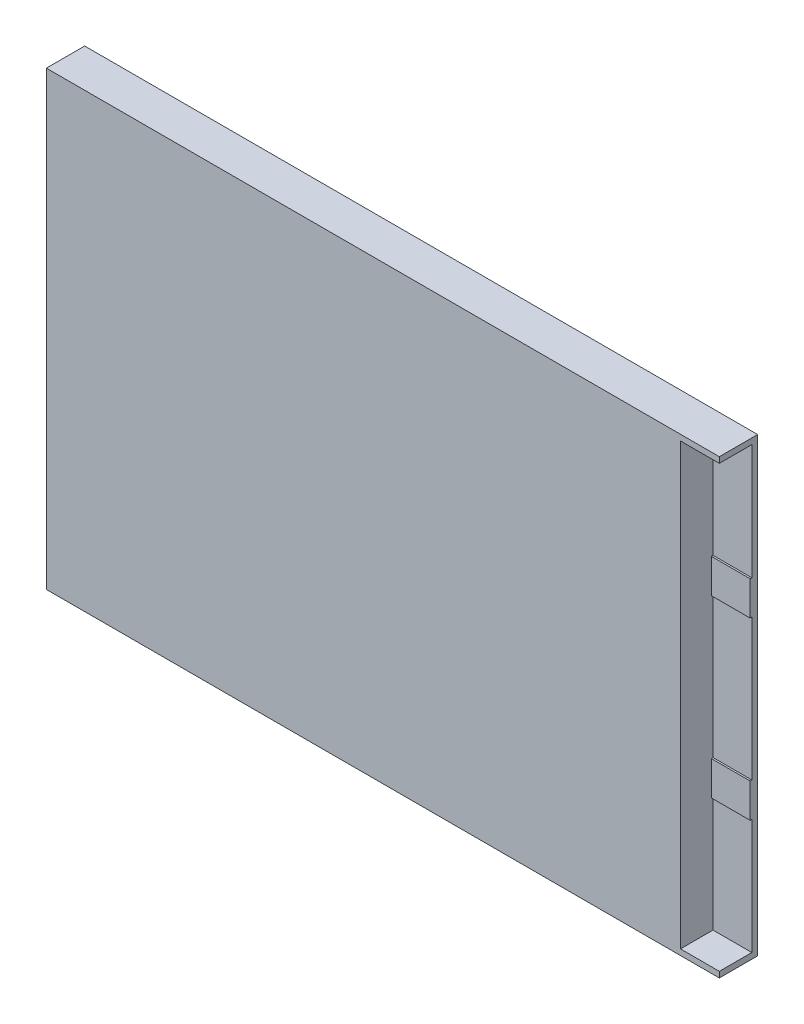
ISO-10303-21;
HEADER;
FILE_DESCRIPTION(('STEP AP214'),'2;1');
FILE_NAME('part.step','',(''),(''),'','','');
FILE_SCHEMA(('AUTOMOTIVE_DESIGN { 1 0 10303 214 1 1 1 1 }'));
ENDSEC;
DATA;
#1=APPLICATION_CONTEXT('core data for automotive mechanical design processes');
#2=APPLICATION_PROTOCOL_DEFINITION('international standard','automotive_design',2000,#1);
#3=PRODUCT_CONTEXT('',#1,'mechanical');
#4=PRODUCT('Part','Part','',(#3));
#5=PRODUCT_RELATED_PRODUCT_CATEGORY('part','',(#4));
#6=PRODUCT_DEFINITION_FORMATION('','',#4);
#7=PRODUCT_DEFINITION_CONTEXT('part definition',#1,'design');
#8=PRODUCT_DEFINITION('design','',#6,#7);
#9=PRODUCT_DEFINITION_SHAPE('','',#8);
#10=(LENGTH_UNIT() NAMED_UNIT(*) SI_UNIT(.MILLI.,.METRE.));
#11=(NAMED_UNIT(*) PLANE_ANGLE_UNIT() SI_UNIT($,.RADIAN.));
#12=(NAMED_UNIT(*) SI_UNIT($,.STERADIAN.) SOLID_ANGLE_UNIT());
#13=UNCERTAINTY_MEASURE_WITH_UNIT(LENGTH_MEASURE(1.E-05),#10,'distance_accuracy_value','');
#14=(GEOMETRIC_REPRESENTATION_CONTEXT(3) GLOBAL_UNCERTAINTY_ASSIGNED_CONTEXT((#13)) GLOBAL_UNIT_ASSIGNED_CONTEXT((#10,
#11,#12)) REPRESENTATION_CONTEXT('',''));
#15=CARTESIAN_POINT('',(0.,0.,0.));
#16=DIRECTION('',(0.,0.,1.));
#17=DIRECTION('',(1.,0.,0.));
#18=AXIS2_PLACEMENT_3D('',#15,#16,#17);
#19=CARTESIAN_POINT('',(50.165,33.655,-1.9939));
#20=DIRECTION('',(0.,0.,-1.));
#21=DIRECTION('',(-1.,0.,0.));
#22=AXIS2_PLACEMENT_3D('',#19,#20,#21);
#23=PLANE('',#22);
#24=DIRECTION('',(-1.,0.,0.));
#25=VECTOR('',#24,1.);
#26=CARTESIAN_POINT('',(50.165,15.5956,-1.9939));
#27=LINE('',#26,#25);
#28=CARTESIAN_POINT('',(50.165,15.5956,-1.9939));
#29=VERTEX_POINT('',#28);
#30=CARTESIAN_POINT('',(44.3738,15.5956,-1.99389999999999));
#31=VERTEX_POINT('',#30);
#32=EDGE_CURVE('E326',#29,#31,#27,.T.);
#33=ORIENTED_EDGE('',*,*,#32,.F.);
#34=DIRECTION('',(0.,1.,0.));
#35=VECTOR('',#34,1.);
#36=CARTESIAN_POINT('',(50.165,-32.7914,-1.99389999999999));
#37=LINE('',#36,#35);
#38=CARTESIAN_POINT('',(50.165,32.7914,-1.99389999999999));
#39=VERTEX_POINT('',#38);
#40=EDGE_CURVE('E175',#29,#39,#37,.T.);
#41=ORIENTED_EDGE('',*,*,#40,.T.);
#42=DIRECTION('',(-1.,0.,0.));
#43=VECTOR('',#42,1.);
#44=CARTESIAN_POINT('',(50.165,32.7914,-1.99389999999999));
#45=LINE('',#44,#43);
#46=CARTESIAN_POINT('',(44.3738,32.7914,-1.99390000000002));
#47=VERTEX_POINT('',#46);
#48=EDGE_CURVE('E209',#39,#47,#45,.T.);
#49=ORIENTED_EDGE('',*,*,#48,.T.);
#50=DIRECTION('',(0.,-1.,0.));
#51=VECTOR('',#50,1.);
#52=CARTESIAN_POINT('',(44.3738,-32.7914,-1.99389999999999));
#53=LINE('',#52,#51);
#54=EDGE_CURVE('E228',#47,#31,#53,.T.);
#55=ORIENTED_EDGE('',*,*,#54,.T.);
#56=EDGE_LOOP('',(#33,#41,#49,#55));
#57=FACE_BOUND('',#56,.T.);
#58=ADVANCED_FACE('F40',(#57),#23,.F.);
#59=DIRECTION('',(1.,0.,0.));
#60=VECTOR('',#59,1.);
#61=CARTESIAN_POINT('',(50.165,10.5156,-1.9939));
#62=LINE('',#61,#60);
#63=CARTESIAN_POINT('',(44.3738,10.5156,-1.99389999999999));
#64=VERTEX_POINT('',#63);
#65=CARTESIAN_POINT('',(50.165,10.5156,-1.99389999999999));
#66=VERTEX_POINT('',#65);
#67=EDGE_CURVE('E171',#64,#66,#62,.T.);
#68=ORIENTED_EDGE('',*,*,#67,.F.);
#69=CARTESIAN_POINT('',(44.3738,-10.5156,-1.9939));
#70=VERTEX_POINT('',#69);
#71=EDGE_CURVE('E231',#64,#70,#53,.T.);
#72=ORIENTED_EDGE('',*,*,#71,.T.);
#73=DIRECTION('',(-1.,0.,0.));
#74=VECTOR('',#73,1.);
#75=CARTESIAN_POINT('',(50.165,-10.5156,-1.9939));
#76=LINE('',#75,#74);
#77=CARTESIAN_POINT('',(50.165,-10.5156,-1.9939));
#78=VERTEX_POINT('',#77);
#79=EDGE_CURVE('E177',#78,#70,#76,.T.);
#80=ORIENTED_EDGE('',*,*,#79,.F.);
#81=EDGE_CURVE('E222',#78,#66,#37,.T.);
#82=ORIENTED_EDGE('',*,*,#81,.T.);
#83=EDGE_LOOP('',(#68,#72,#80,#82));
#84=FACE_BOUND('',#83,.T.);
#85=ADVANCED_FACE('F317',(#84),#23,.F.);
#86=CARTESIAN_POINT('',(44.3738,-32.7914,-68.6954955138369));
#87=DIRECTION('',(-1.,0.,0.));
#88=DIRECTION('',(0.,-1.,0.));
#89=AXIS2_PLACEMENT_3D('',#86,#87,#88);
#90=PLANE('',#89);
#91=DIRECTION('',(0.,0.,-1.));
#92=VECTOR('',#91,1.);
#93=CARTESIAN_POINT('',(44.3738,15.5956,-1.7399));
#94=LINE('',#93,#92);
#95=CARTESIAN_POINT('',(44.3738,15.5956,-1.7399));
#96=VERTEX_POINT('',#95);
#97=EDGE_CURVE('E160',#96,#31,#94,.T.);
#98=ORIENTED_EDGE('',*,*,#97,.T.);
#99=ORIENTED_EDGE('',*,*,#54,.F.);
#100=DIRECTION('',(0.,0.,1.));
#101=VECTOR('',#100,1.);
#102=CARTESIAN_POINT('',(44.3738,32.7914,-68.6954955138369));
#103=LINE('',#102,#101);
#104=CARTESIAN_POINT('',(44.3738,32.7914,2.8575));
#105=VERTEX_POINT('',#104);
#106=EDGE_CURVE('E217',#47,#105,#103,.T.);
#107=ORIENTED_EDGE('',*,*,#106,.T.);
#108=DIRECTION('',(0.,-1.,0.));
#109=VECTOR('',#108,1.);
#110=CARTESIAN_POINT('',(44.3738,-32.7914,2.8575));
#111=LINE('',#110,#109);
#112=CARTESIAN_POINT('',(44.3738,-32.7914,2.8575));
#113=VERTEX_POINT('',#112);
#114=EDGE_CURVE('E210',#105,#113,#111,.T.);
#115=ORIENTED_EDGE('',*,*,#114,.T.);
#116=DIRECTION('',(0.,0.,1.));
#117=VECTOR('',#116,1.);
#118=CARTESIAN_POINT('',(44.3738,-32.7914,-68.6954955138369));
#119=LINE('',#118,#117);
#120=CARTESIAN_POINT('',(44.3738,-32.7914,-1.99389999999999));
#121=VERTEX_POINT('',#120);
#122=EDGE_CURVE('E227',#121,#113,#119,.T.);
#123=ORIENTED_EDGE('',*,*,#122,.F.);
#124=CARTESIAN_POINT('',(44.3738,-15.5956,-1.9939));
#125=VERTEX_POINT('',#124);
#126=EDGE_CURVE('E232',#125,#121,#53,.T.);
#127=ORIENTED_EDGE('',*,*,#126,.F.);
#128=DIRECTION('',(0.,0.,-1.));
#129=VECTOR('',#128,1.);
#130=CARTESIAN_POINT('',(44.3738,-15.5956,-1.7399));
#131=LINE('',#130,#129);
#132=CARTESIAN_POINT('',(44.3738,-15.5956,-1.7399));
#133=VERTEX_POINT('',#132);
#134=EDGE_CURVE('E199',#133,#125,#131,.T.);
#135=ORIENTED_EDGE('',*,*,#134,.F.);
#136=DIRECTION('',(0.,-1.,0.));
#137=VECTOR('',#136,1.);
#138=CARTESIAN_POINT('',(44.3738,-15.5956,-1.7399));
#139=LINE('',#138,#137);
#140=CARTESIAN_POINT('',(44.3738,-10.5156,-1.7399));
#141=VERTEX_POINT('',#140);
#142=EDGE_CURVE('E191',#141,#133,#139,.T.);
#143=ORIENTED_EDGE('',*,*,#142,.F.);
#144=DIRECTION('',(0.,0.,-1.));
#145=VECTOR('',#144,1.);
#146=CARTESIAN_POINT('',(44.3738,-10.5156,-1.7399));
#147=LINE('',#146,#145);
#148=EDGE_CURVE('E201',#141,#70,#147,.T.);
#149=ORIENTED_EDGE('',*,*,#148,.T.);
#150=ORIENTED_EDGE('',*,*,#71,.F.);
#151=DIRECTION('',(0.,0.,-1.));
#152=VECTOR('',#151,1.);
#153=CARTESIAN_POINT('',(44.3738,10.5156,-1.7399));
#154=LINE('',#153,#152);
#155=CARTESIAN_POINT('',(44.3738,10.5156,-1.7399));
#156=VERTEX_POINT('',#155);
#157=EDGE_CURVE('E60',#156,#64,#154,.T.);
#158=ORIENTED_EDGE('',*,*,#157,.F.);
#159=DIRECTION('',(0.,-1.,0.));
#160=VECTOR('',#159,1.);
#161=CARTESIAN_POINT('',(44.3738,10.5156,-1.7399));
#162=LINE('',#161,#160);
#163=EDGE_CURVE('E55',#96,#156,#162,.T.);
#164=ORIENTED_EDGE('',*,*,#163,.F.);
#165=EDGE_LOOP('',(#98,#99,#107,#115,#123,#127,#135,#143,#149,#150,#158,#164));
#166=FACE_BOUND('',#165,.T.);
#167=ADVANCED_FACE('F299',(#166),#90,.F.);
#168=DIRECTION('',(1.,0.,0.));
#169=VECTOR('',#168,1.);
#170=CARTESIAN_POINT('',(50.165,-15.5956,-1.9939));
#171=LINE('',#170,#169);
#172=CARTESIAN_POINT('',(50.165,-15.5956,-1.9939));
#173=VERTEX_POINT('',#172);
#174=EDGE_CURVE('E180',#125,#173,#171,.T.);
#175=ORIENTED_EDGE('',*,*,#174,.F.);
#176=ORIENTED_EDGE('',*,*,#126,.T.);
#177=DIRECTION('',(1.,0.,0.));
#178=VECTOR('',#177,1.);
#179=CARTESIAN_POINT('',(50.165,-32.7914,-1.99389999999999));
#180=LINE('',#179,#178);
#181=CARTESIAN_POINT('',(50.165,-32.7914,-1.99389999999999));
#182=VERTEX_POINT('',#181);
#183=EDGE_CURVE('E223',#121,#182,#180,.T.);
#184=ORIENTED_EDGE('',*,*,#183,.T.);
#185=EDGE_CURVE('E218',#182,#173,#37,.T.);
#186=ORIENTED_EDGE('',*,*,#185,.T.);
#187=EDGE_LOOP('',(#175,#176,#184,#186));
#188=FACE_BOUND('',#187,.T.);
#189=ADVANCED_FACE('F306',(#188),#23,.F.);
#190=CARTESIAN_POINT('',(50.165,-33.655,2.8575));
#191=DIRECTION('',(-1.,0.,0.));
#192=DIRECTION('',(0.,0.,1.));
#193=AXIS2_PLACEMENT_3D('',#190,#191,#192);
#194=PLANE('',#193);
#195=DIRECTION('',(0.,1.,0.));
#196=VECTOR('',#195,1.);
#197=CARTESIAN_POINT('',(50.165,-33.655,2.8575));
#198=LINE('',#197,#196);
#199=CARTESIAN_POINT('',(50.165,32.7914,2.8575));
#200=VERTEX_POINT('',#199);
#201=CARTESIAN_POINT('',(50.165,33.655,2.8575));
#202=VERTEX_POINT('',#201);
#203=EDGE_CURVE('E244',#200,#202,#198,.T.);
#204=ORIENTED_EDGE('',*,*,#203,.F.);
#205=DIRECTION('',(0.,0.,1.));
#206=VECTOR('',#205,1.);
#207=CARTESIAN_POINT('',(50.165,32.7914,-68.6954955138369));
#208=LINE('',#207,#206);
#209=EDGE_CURVE('E221',#39,#200,#208,.T.);
#210=ORIENTED_EDGE('',*,*,#209,.F.);
#211=ORIENTED_EDGE('',*,*,#40,.F.);
#212=DIRECTION('',(0.,0.,-1.));
#213=VECTOR('',#212,1.);
#214=CARTESIAN_POINT('',(50.165,15.5956,-1.7399));
#215=LINE('',#214,#213);
#216=CARTESIAN_POINT('',(50.165,15.5956,-1.7399));
#217=VERTEX_POINT('',#216);
#218=EDGE_CURVE('E159',#217,#29,#215,.T.);
#219=ORIENTED_EDGE('',*,*,#218,.F.);
#220=DIRECTION('',(0.,1.,0.));
#221=VECTOR('',#220,1.);
#222=CARTESIAN_POINT('',(50.165,10.5156,-1.7399));
#223=LINE('',#222,#221);
#224=CARTESIAN_POINT('',(50.165,10.5156,-1.7399));
#225=VERTEX_POINT('',#224);
#226=EDGE_CURVE('E162',#225,#217,#223,.T.);
#227=ORIENTED_EDGE('',*,*,#226,.F.);
#228=DIRECTION('',(0.,0.,-1.));
#229=VECTOR('',#228,1.);
#230=CARTESIAN_POINT('',(50.165,10.5156,-1.7399));
#231=LINE('',#230,#229);
#232=EDGE_CURVE('E324',#225,#66,#231,.T.);
#233=ORIENTED_EDGE('',*,*,#232,.T.);
#234=ORIENTED_EDGE('',*,*,#81,.F.);
#235=DIRECTION('',(0.,0.,-1.));
#236=VECTOR('',#235,1.);
#237=CARTESIAN_POINT('',(50.165,-10.5156,-1.7399));
#238=LINE('',#237,#236);
#239=CARTESIAN_POINT('',(50.165,-10.5156,-1.7399));
#240=VERTEX_POINT('',#239);
#241=EDGE_CURVE('E204',#240,#78,#238,.T.);
#242=ORIENTED_EDGE('',*,*,#241,.F.);
#243=DIRECTION('',(0.,1.,0.));
#244=VECTOR('',#243,1.);
#245=CARTESIAN_POINT('',(50.165,-15.5956,-1.7399));
#246=LINE('',#245,#244);
#247=CARTESIAN_POINT('',(50.165,-15.5956,-1.7399));
#248=VERTEX_POINT('',#247);
#249=EDGE_CURVE('E185',#248,#240,#246,.T.);
#250=ORIENTED_EDGE('',*,*,#249,.F.);
#251=DIRECTION('',(0.,0.,-1.));
#252=VECTOR('',#251,1.);
#253=CARTESIAN_POINT('',(50.165,-15.5956,-1.7399));
#254=LINE('',#253,#252);
#255=EDGE_CURVE('E194',#248,#173,#254,.T.);
#256=ORIENTED_EDGE('',*,*,#255,.T.);
#257=ORIENTED_EDGE('',*,*,#185,.F.);
#258=DIRECTION('',(0.,0.,1.));
#259=VECTOR('',#258,1.);
#260=CARTESIAN_POINT('',(50.165,-32.7914,-68.6954955138369));
#261=LINE('',#260,#259);
#262=CARTESIAN_POINT('',(50.165,-32.7914,2.8575));
#263=VERTEX_POINT('',#262);
#264=EDGE_CURVE('E226',#182,#263,#261,.T.);
#265=ORIENTED_EDGE('',*,*,#264,.T.);
#266=CARTESIAN_POINT('',(50.165,-33.655,2.8575));
#267=VERTEX_POINT('',#266);
#268=EDGE_CURVE('E240',#267,#263,#198,.T.);
#269=ORIENTED_EDGE('',*,*,#268,.F.);
#270=DIRECTION('',(0.,0.,-1.));
#271=VECTOR('',#270,1.);
#272=CARTESIAN_POINT('',(50.165,-33.655,2.8575));
#273=LINE('',#272,#271);
#274=CARTESIAN_POINT('',(50.165,-33.655,-2.8575));
#275=VERTEX_POINT('',#274);
#276=EDGE_CURVE('E252',#267,#275,#273,.T.);
#277=ORIENTED_EDGE('',*,*,#276,.T.);
#278=DIRECTION('',(0.,1.,0.));
#279=VECTOR('',#278,1.);
#280=CARTESIAN_POINT('',(50.165,-33.655,-2.8575));
#281=LINE('',#280,#279);
#282=CARTESIAN_POINT('',(50.165,33.655,-2.8575));
#283=VERTEX_POINT('',#282);
#284=EDGE_CURVE('E239',#275,#283,#281,.T.);
#285=ORIENTED_EDGE('',*,*,#284,.T.);
#286=DIRECTION('',(0.,0.,-1.));
#287=VECTOR('',#286,1.);
#288=CARTESIAN_POINT('',(50.165,33.655,2.8575));
#289=LINE('',#288,#287);
#290=EDGE_CURVE('E12',#202,#283,#289,.T.);
#291=ORIENTED_EDGE('',*,*,#290,.F.);
#292=EDGE_LOOP('',(#204,#210,#211,#219,#227,#233,#234,#242,#250,#256,#257,#265,#269,#277,#285,#291));
#293=FACE_BOUND('',#292,.T.);
#294=ADVANCED_FACE('F42',(#293),#194,.F.);
#295=CARTESIAN_POINT('',(-50.165,33.655,2.8575));
#296=DIRECTION('',(0.,-1.,0.));
#297=DIRECTION('',(0.,0.,-1.));
#298=AXIS2_PLACEMENT_3D('',#295,#296,#297);
#299=PLANE('',#298);
#300=DIRECTION('',(-1.,0.,0.));
#301=VECTOR('',#300,1.);
#302=CARTESIAN_POINT('',(-50.165,33.655,-2.8575));
#303=LINE('',#302,#301);
#304=CARTESIAN_POINT('',(-50.165,33.655,-2.8575));
#305=VERTEX_POINT('',#304);
#306=EDGE_CURVE('E255',#283,#305,#303,.T.);
#307=ORIENTED_EDGE('',*,*,#306,.T.);
#308=DIRECTION('',(0.,0.,-1.));
#309=VECTOR('',#308,1.);
#310=CARTESIAN_POINT('',(-50.165,33.655,2.8575));
#311=LINE('',#310,#309);
#312=CARTESIAN_POINT('',(-50.165,33.655,2.8575));
#313=VERTEX_POINT('',#312);
#314=EDGE_CURVE('E48',#313,#305,#311,.T.);
#315=ORIENTED_EDGE('',*,*,#314,.F.);
#316=DIRECTION('',(-1.,0.,0.));
#317=VECTOR('',#316,1.);
#318=CARTESIAN_POINT('',(-50.165,33.655,2.8575));
#319=LINE('',#318,#317);
#320=EDGE_CURVE('E243',#202,#313,#319,.T.);
#321=ORIENTED_EDGE('',*,*,#320,.F.);
#322=ORIENTED_EDGE('',*,*,#290,.T.);
#323=EDGE_LOOP('',(#307,#315,#321,#322));
#324=FACE_BOUND('',#323,.T.);
#325=ADVANCED_FACE('F293',(#324),#299,.F.);
#326=CARTESIAN_POINT('',(-50.165,-33.655,2.8575));
#327=DIRECTION('',(1.,0.,0.));
#328=DIRECTION('',(0.,0.,-1.));
#329=AXIS2_PLACEMENT_3D('',#326,#327,#328);
#330=PLANE('',#329);
#331=DIRECTION('',(0.,-1.,0.));
#332=VECTOR('',#331,1.);
#333=CARTESIAN_POINT('',(-50.165,-33.655,-2.8575));
#334=LINE('',#333,#332);
#335=CARTESIAN_POINT('',(-50.165,-33.655,-2.8575));
#336=VERTEX_POINT('',#335);
#337=EDGE_CURVE('E258',#305,#336,#334,.T.);
#338=ORIENTED_EDGE('',*,*,#337,.T.);
#339=DIRECTION('',(0.,0.,-1.));
#340=VECTOR('',#339,1.);
#341=CARTESIAN_POINT('',(-50.165,-33.655,2.8575));
#342=LINE('',#341,#340);
#343=CARTESIAN_POINT('',(-50.165,-33.655,2.8575));
#344=VERTEX_POINT('',#343);
#345=EDGE_CURVE('E265',#344,#336,#342,.T.);
#346=ORIENTED_EDGE('',*,*,#345,.F.);
#347=DIRECTION('',(0.,-1.,0.));
#348=VECTOR('',#347,1.);
#349=CARTESIAN_POINT('',(-50.165,-33.655,2.8575));
#350=LINE('',#349,#348);
#351=EDGE_CURVE('E247',#313,#344,#350,.T.);
#352=ORIENTED_EDGE('',*,*,#351,.F.);
#353=ORIENTED_EDGE('',*,*,#314,.T.);
#354=EDGE_LOOP('',(#338,#346,#352,#353));
#355=FACE_BOUND('',#354,.T.);
#356=ADVANCED_FACE('F273',(#355),#330,.F.);
#357=CARTESIAN_POINT('',(-50.165,-33.655,2.8575));
#358=DIRECTION('',(0.,1.,0.));
#359=DIRECTION('',(0.,0.,1.));
#360=AXIS2_PLACEMENT_3D('',#357,#358,#359);
#361=PLANE('',#360);
#362=DIRECTION('',(1.,0.,0.));
#363=VECTOR('',#362,1.);
#364=CARTESIAN_POINT('',(-50.165,-33.655,-2.8575));
#365=LINE('',#364,#363);
#366=EDGE_CURVE('E261',#336,#275,#365,.T.);
#367=ORIENTED_EDGE('',*,*,#366,.T.);
#368=ORIENTED_EDGE('',*,*,#276,.F.);
#369=DIRECTION('',(1.,0.,0.));
#370=VECTOR('',#369,1.);
#371=CARTESIAN_POINT('',(-50.165,-33.655,2.8575));
#372=LINE('',#371,#370);
#373=EDGE_CURVE('E250',#344,#267,#372,.T.);
#374=ORIENTED_EDGE('',*,*,#373,.F.);
#375=ORIENTED_EDGE('',*,*,#345,.T.);
#376=EDGE_LOOP('',(#367,#368,#374,#375));
#377=FACE_BOUND('',#376,.T.);
#378=ADVANCED_FACE('F283',(#377),#361,.F.);
#379=CARTESIAN_POINT('',(50.165,33.655,2.8575));
#380=DIRECTION('',(0.,0.,-1.));
#381=DIRECTION('',(-1.,0.,0.));
#382=AXIS2_PLACEMENT_3D('',#379,#380,#381);
#383=PLANE('',#382);
#384=ORIENTED_EDGE('',*,*,#114,.F.);
#385=DIRECTION('',(-1.,0.,0.));
#386=VECTOR('',#385,1.);
#387=CARTESIAN_POINT('',(50.165,32.7914,2.8575));
#388=LINE('',#387,#386);
#389=EDGE_CURVE('E206',#200,#105,#388,.T.);
#390=ORIENTED_EDGE('',*,*,#389,.F.);
#391=ORIENTED_EDGE('',*,*,#203,.T.);
#392=ORIENTED_EDGE('',*,*,#320,.T.);
#393=ORIENTED_EDGE('',*,*,#351,.T.);
#394=ORIENTED_EDGE('',*,*,#373,.T.);
#395=ORIENTED_EDGE('',*,*,#268,.T.);
#396=DIRECTION('',(1.,0.,0.));
#397=VECTOR('',#396,1.);
#398=CARTESIAN_POINT('',(50.165,-32.7914,2.8575));
#399=LINE('',#398,#397);
#400=EDGE_CURVE('E207',#113,#263,#399,.T.);
#401=ORIENTED_EDGE('',*,*,#400,.F.);
#402=EDGE_LOOP('',(#384,#390,#391,#392,#393,#394,#395,#401));
#403=FACE_BOUND('',#402,.T.);
#404=ADVANCED_FACE('F291',(#403),#383,.F.);
#405=CARTESIAN_POINT('',(50.165,33.655,-2.8575));
#406=DIRECTION('',(0.,0.,-1.));
#407=DIRECTION('',(-1.,0.,0.));
#408=AXIS2_PLACEMENT_3D('',#405,#406,#407);
#409=PLANE('',#408);
#410=ORIENTED_EDGE('',*,*,#284,.F.);
#411=ORIENTED_EDGE('',*,*,#366,.F.);
#412=ORIENTED_EDGE('',*,*,#337,.F.);
#413=ORIENTED_EDGE('',*,*,#306,.F.);
#414=EDGE_LOOP('',(#410,#411,#412,#413));
#415=FACE_BOUND('',#414,.T.);
#416=ADVANCED_FACE('F280',(#415),#409,.T.);
#417=CARTESIAN_POINT('',(50.165,32.7914,-68.6954955138369));
#418=DIRECTION('',(0.,1.,0.));
#419=DIRECTION('',(0.,0.,1.));
#420=AXIS2_PLACEMENT_3D('',#417,#418,#419);
#421=PLANE('',#420);
#422=ORIENTED_EDGE('',*,*,#209,.T.);
#423=ORIENTED_EDGE('',*,*,#389,.T.);
#424=ORIENTED_EDGE('',*,*,#106,.F.);
#425=ORIENTED_EDGE('',*,*,#48,.F.);
#426=EDGE_LOOP('',(#422,#423,#424,#425));
#427=FACE_BOUND('',#426,.T.);
#428=ADVANCED_FACE('F296',(#427),#421,.F.);
#429=CARTESIAN_POINT('',(50.165,-32.7914,-68.6954955138369));
#430=DIRECTION('',(0.,-1.,0.));
#431=DIRECTION('',(0.,0.,-1.));
#432=AXIS2_PLACEMENT_3D('',#429,#430,#431);
#433=PLANE('',#432);
#434=ORIENTED_EDGE('',*,*,#122,.T.);
#435=ORIENTED_EDGE('',*,*,#400,.T.);
#436=ORIENTED_EDGE('',*,*,#264,.F.);
#437=ORIENTED_EDGE('',*,*,#183,.F.);
#438=EDGE_LOOP('',(#434,#435,#436,#437));
#439=FACE_BOUND('',#438,.T.);
#440=ADVANCED_FACE('F303',(#439),#433,.F.);
#441=CARTESIAN_POINT('',(50.165,-10.5156,-1.7399));
#442=DIRECTION('',(0.,-1.,0.));
#443=DIRECTION('',(1.,0.,0.));
#444=AXIS2_PLACEMENT_3D('',#441,#442,#443);
#445=PLANE('',#444);
#446=ORIENTED_EDGE('',*,*,#79,.T.);
#447=ORIENTED_EDGE('',*,*,#148,.F.);
#448=DIRECTION('',(-1.,0.,0.));
#449=VECTOR('',#448,1.);
#450=CARTESIAN_POINT('',(50.165,-10.5156,-1.7399));
#451=LINE('',#450,#449);
#452=EDGE_CURVE('E188',#240,#141,#451,.T.);
#453=ORIENTED_EDGE('',*,*,#452,.F.);
#454=ORIENTED_EDGE('',*,*,#241,.T.);
#455=EDGE_LOOP('',(#446,#447,#453,#454));
#456=FACE_BOUND('',#455,.T.);
#457=ADVANCED_FACE('F321',(#456),#445,.F.);
#458=CARTESIAN_POINT('',(50.165,-15.5956,-1.7399));
#459=DIRECTION('',(0.,1.,0.));
#460=DIRECTION('',(0.,0.,1.));
#461=AXIS2_PLACEMENT_3D('',#458,#459,#460);
#462=PLANE('',#461);
#463=ORIENTED_EDGE('',*,*,#174,.T.);
#464=ORIENTED_EDGE('',*,*,#255,.F.);
#465=DIRECTION('',(1.,0.,0.));
#466=VECTOR('',#465,1.);
#467=CARTESIAN_POINT('',(50.165,-15.5956,-1.7399));
#468=LINE('',#467,#466);
#469=EDGE_CURVE('E193',#133,#248,#468,.T.);
#470=ORIENTED_EDGE('',*,*,#469,.F.);
#471=ORIENTED_EDGE('',*,*,#134,.T.);
#472=EDGE_LOOP('',(#463,#464,#470,#471));
#473=FACE_BOUND('',#472,.T.);
#474=ADVANCED_FACE('F312',(#473),#462,.F.);
#475=CARTESIAN_POINT('',(50.165,-10.5156,-1.7399));
#476=DIRECTION('',(0.,0.,1.));
#477=DIRECTION('',(1.,0.,0.));
#478=AXIS2_PLACEMENT_3D('',#475,#476,#477);
#479=PLANE('',#478);
#480=ORIENTED_EDGE('',*,*,#249,.T.);
#481=ORIENTED_EDGE('',*,*,#452,.T.);
#482=ORIENTED_EDGE('',*,*,#142,.T.);
#483=ORIENTED_EDGE('',*,*,#469,.T.);
#484=EDGE_LOOP('',(#480,#481,#482,#483));
#485=FACE_BOUND('',#484,.T.);
#486=ADVANCED_FACE('F323',(#485),#479,.T.);
#487=CARTESIAN_POINT('',(50.165,15.5956,-1.7399));
#488=DIRECTION('',(0.,-1.,0.));
#489=DIRECTION('',(0.,0.,-1.));
#490=AXIS2_PLACEMENT_3D('',#487,#488,#489);
#491=PLANE('',#490);
#492=ORIENTED_EDGE('',*,*,#32,.T.);
#493=ORIENTED_EDGE('',*,*,#97,.F.);
#494=DIRECTION('',(-1.,0.,0.));
#495=VECTOR('',#494,1.);
#496=CARTESIAN_POINT('',(50.165,15.5956,-1.7399));
#497=LINE('',#496,#495);
#498=EDGE_CURVE('E154',#217,#96,#497,.T.);
#499=ORIENTED_EDGE('',*,*,#498,.F.);
#500=ORIENTED_EDGE('',*,*,#218,.T.);
#501=EDGE_LOOP('',(#492,#493,#499,#500));
#502=FACE_BOUND('',#501,.T.);
#503=ADVANCED_FACE('F157',(#502),#491,.F.);
#504=CARTESIAN_POINT('',(50.165,10.5156,-1.7399));
#505=DIRECTION('',(0.,1.,0.));
#506=DIRECTION('',(0.,0.,1.));
#507=AXIS2_PLACEMENT_3D('',#504,#505,#506);
#508=PLANE('',#507);
#509=ORIENTED_EDGE('',*,*,#67,.T.);
#510=ORIENTED_EDGE('',*,*,#232,.F.);
#511=DIRECTION('',(1.,0.,0.));
#512=VECTOR('',#511,1.);
#513=CARTESIAN_POINT('',(50.165,10.5156,-1.7399));
#514=LINE('',#513,#512);
#515=EDGE_CURVE('E167',#156,#225,#514,.T.);
#516=ORIENTED_EDGE('',*,*,#515,.F.);
#517=ORIENTED_EDGE('',*,*,#157,.T.);
#518=EDGE_LOOP('',(#509,#510,#516,#517));
#519=FACE_BOUND('',#518,.T.);
#520=ADVANCED_FACE('F333',(#519),#508,.F.);
#521=CARTESIAN_POINT('',(50.165,15.5956,-1.7399));
#522=DIRECTION('',(0.,0.,1.));
#523=DIRECTION('',(1.,0.,0.));
#524=AXIS2_PLACEMENT_3D('',#521,#522,#523);
#525=PLANE('',#524);
#526=ORIENTED_EDGE('',*,*,#226,.T.);
#527=ORIENTED_EDGE('',*,*,#498,.T.);
#528=ORIENTED_EDGE('',*,*,#163,.T.);
#529=ORIENTED_EDGE('',*,*,#515,.T.);
#530=EDGE_LOOP('',(#526,#527,#528,#529));
#531=FACE_BOUND('',#530,.T.);
#532=ADVANCED_FACE('F165',(#531),#525,.T.);
#533=CLOSED_SHELL('',(#58,#85,#167,#189,#294,#325,#356,#378,#404,#416,#428,#440,#457,#474,#486,
#503,#520,#532));
#534=MANIFOLD_SOLID_BREP('B2',#533);
#535=ADVANCED_BREP_SHAPE_REPRESENTATION('',(#18,#534),#14);
#536=SHAPE_DEFINITION_REPRESENTATION(#9,#535);
ENDSEC;
END-ISO-10303-21;
